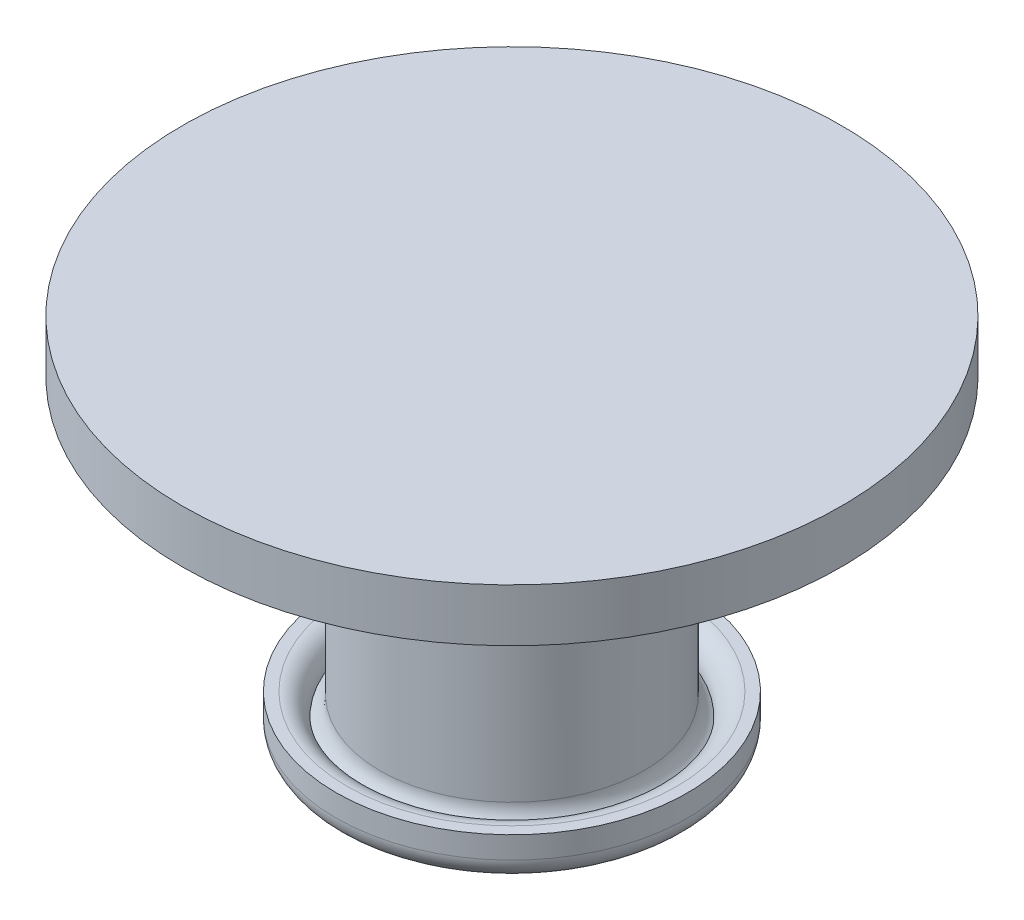
ISO-10303-21;
HEADER;
FILE_DESCRIPTION(('STEP AP214'),'2;1');
FILE_NAME('part.step','',(''),(''),'','','');
FILE_SCHEMA(('AUTOMOTIVE_DESIGN { 1 0 10303 214 1 1 1 1 }'));
ENDSEC;
DATA;
#1=APPLICATION_CONTEXT('core data for automotive mechanical design processes');
#2=APPLICATION_PROTOCOL_DEFINITION('international standard','automotive_design',2000,#1);
#3=PRODUCT_CONTEXT('',#1,'mechanical');
#4=PRODUCT('Part','Part','',(#3));
#5=PRODUCT_RELATED_PRODUCT_CATEGORY('part','',(#4));
#6=PRODUCT_DEFINITION_FORMATION('','',#4);
#7=PRODUCT_DEFINITION_CONTEXT('part definition',#1,'design');
#8=PRODUCT_DEFINITION('design','',#6,#7);
#9=PRODUCT_DEFINITION_SHAPE('','',#8);
#10=(LENGTH_UNIT() NAMED_UNIT(*) SI_UNIT(.MILLI.,.METRE.));
#11=(NAMED_UNIT(*) PLANE_ANGLE_UNIT() SI_UNIT($,.RADIAN.));
#12=(NAMED_UNIT(*) SI_UNIT($,.STERADIAN.) SOLID_ANGLE_UNIT());
#13=UNCERTAINTY_MEASURE_WITH_UNIT(LENGTH_MEASURE(1.E-05),#10,'distance_accuracy_value','');
#14=(GEOMETRIC_REPRESENTATION_CONTEXT(3) GLOBAL_UNCERTAINTY_ASSIGNED_CONTEXT((#13)) GLOBAL_UNIT_ASSIGNED_CONTEXT((#10,
#11,#12)) REPRESENTATION_CONTEXT('',''));
#15=CARTESIAN_POINT('',(0.,0.,0.));
#16=DIRECTION('',(0.,0.,1.));
#17=DIRECTION('',(1.,0.,0.));
#18=AXIS2_PLACEMENT_3D('',#15,#16,#17);
#19=CARTESIAN_POINT('',(0.,-7.2,0.));
#20=DIRECTION('',(0.,1.,0.));
#21=DIRECTION('',(0.,0.,1.));
#22=AXIS2_PLACEMENT_3D('',#19,#20,#21);
#23=CYLINDRICAL_SURFACE('',#22,3.);
#24=CARTESIAN_POINT('',(0.,-6.26698729810778,0.));
#25=DIRECTION('',(0.,-1.,0.));
#26=DIRECTION('',(0.,0.,-1.));
#27=AXIS2_PLACEMENT_3D('',#24,#25,#26);
#28=CIRCLE('',#27,3.);
#29=CARTESIAN_POINT('',(0.,-6.26698729810778,-3.));
#30=VERTEX_POINT('',#29);
#31=EDGE_CURVE('E129',#30,#30,#28,.F.);
#32=ORIENTED_EDGE('',*,*,#31,.T.);
#33=EDGE_LOOP('',(#32));
#34=FACE_BOUND('',#33,.T.);
#35=CARTESIAN_POINT('',(0.,0.,0.));
#36=DIRECTION('',(0.,1.,0.));
#37=DIRECTION('',(0.,0.,1.));
#38=AXIS2_PLACEMENT_3D('',#35,#36,#37);
#39=CIRCLE('',#38,3.);
#40=CARTESIAN_POINT('',(0.,0.,3.));
#41=VERTEX_POINT('',#40);
#42=EDGE_CURVE('E131',#41,#41,#39,.F.);
#43=ORIENTED_EDGE('',*,*,#42,.T.);
#44=EDGE_LOOP('',(#43));
#45=FACE_BOUND('',#44,.T.);
#46=ADVANCED_FACE('F30',(#34,#45),#23,.T.);
#47=CARTESIAN_POINT('',(0.,0.,0.));
#48=DIRECTION('',(0.,1.,0.));
#49=DIRECTION('',(0.,0.,1.));
#50=AXIS2_PLACEMENT_3D('',#47,#48,#49);
#51=PLANE('',#50);
#52=CARTESIAN_POINT('',(0.,0.,0.));
#53=DIRECTION('',(0.,1.,0.));
#54=DIRECTION('',(0.,0.,1.));
#55=AXIS2_PLACEMENT_3D('',#52,#53,#54);
#56=CIRCLE('',#55,7.5);
#57=CARTESIAN_POINT('',(0.,0.,7.5));
#58=VERTEX_POINT('',#57);
#59=EDGE_CURVE('E52',#58,#58,#56,.T.);
#60=ORIENTED_EDGE('',*,*,#59,.F.);
#61=EDGE_LOOP('',(#60));
#62=FACE_BOUND('',#61,.T.);
#63=ORIENTED_EDGE('',*,*,#42,.F.);
#64=EDGE_LOOP('',(#63));
#65=FACE_BOUND('',#64,.T.);
#66=ADVANCED_FACE('F72',(#62,#65),#51,.F.);
#67=CARTESIAN_POINT('',(0.,1.2,0.));
#68=DIRECTION('',(0.,-1.,0.));
#69=DIRECTION('',(0.,0.,-1.));
#70=AXIS2_PLACEMENT_3D('',#67,#68,#69);
#71=CYLINDRICAL_SURFACE('',#70,7.5);
#72=CARTESIAN_POINT('',(0.,1.2,0.));
#73=DIRECTION('',(0.,1.,0.));
#74=DIRECTION('',(0.,0.,1.));
#75=AXIS2_PLACEMENT_3D('',#72,#73,#74);
#76=CIRCLE('',#75,7.5);
#77=CARTESIAN_POINT('',(0.,1.2,7.5));
#78=VERTEX_POINT('',#77);
#79=EDGE_CURVE('E134',#78,#78,#76,.T.);
#80=ORIENTED_EDGE('',*,*,#79,.F.);
#81=EDGE_LOOP('',(#80));
#82=FACE_BOUND('',#81,.T.);
#83=ORIENTED_EDGE('',*,*,#59,.T.);
#84=EDGE_LOOP('',(#83));
#85=FACE_BOUND('',#84,.T.);
#86=ADVANCED_FACE('F78',(#82,#85),#71,.T.);
#87=CARTESIAN_POINT('',(0.,1.2,0.));
#88=DIRECTION('',(0.,1.,0.));
#89=DIRECTION('',(0.,0.,1.));
#90=AXIS2_PLACEMENT_3D('',#87,#88,#89);
#91=PLANE('',#90);
#92=ORIENTED_EDGE('',*,*,#79,.T.);
#93=EDGE_LOOP('',(#92));
#94=FACE_BOUND('',#93,.T.);
#95=ADVANCED_FACE('F87',(#94),#91,.T.);
#96=CARTESIAN_POINT('',(0.,-7.2,0.));
#97=DIRECTION('',(0.,-1.,0.));
#98=DIRECTION('',(0.,0.,-1.));
#99=AXIS2_PLACEMENT_3D('',#96,#97,#98);
#100=PLANE('',#99);
#101=CARTESIAN_POINT('',(0.,-7.2,0.));
#102=DIRECTION('',(0.,-1.,0.));
#103=DIRECTION('',(0.,0.,-1.));
#104=AXIS2_PLACEMENT_3D('',#101,#102,#103);
#105=CIRCLE('',#104,3.5);
#106=CARTESIAN_POINT('',(0.,-7.2,-3.5));
#107=VERTEX_POINT('',#106);
#108=EDGE_CURVE('E122',#107,#107,#105,.T.);
#109=ORIENTED_EDGE('',*,*,#108,.T.);
#110=EDGE_LOOP('',(#109));
#111=FACE_BOUND('',#110,.T.);
#112=CARTESIAN_POINT('',(0.,-7.2,0.));
#113=DIRECTION('',(0.,-1.,0.));
#114=DIRECTION('',(0.,0.,-1.));
#115=AXIS2_PLACEMENT_3D('',#112,#113,#114);
#116=CIRCLE('',#115,3.);
#117=CARTESIAN_POINT('',(0.,-7.2,-3.));
#118=VERTEX_POINT('',#117);
#119=EDGE_CURVE('E124',#118,#118,#116,.F.);
#120=ORIENTED_EDGE('',*,*,#119,.T.);
#121=EDGE_LOOP('',(#120));
#122=FACE_BOUND('',#121,.T.);
#123=ADVANCED_FACE('F85',(#111,#122),#100,.T.);
#124=CARTESIAN_POINT('',(0.,-6.2,0.));
#125=DIRECTION('',(0.,-1.,0.));
#126=DIRECTION('',(0.,0.,-1.));
#127=AXIS2_PLACEMENT_3D('',#124,#125,#126);
#128=CYLINDRICAL_SURFACE('',#127,4.);
#129=CARTESIAN_POINT('',(0.,-6.7,0.));
#130=DIRECTION('',(0.,-1.,0.));
#131=DIRECTION('',(0.,0.,-1.));
#132=AXIS2_PLACEMENT_3D('',#129,#130,#131);
#133=CIRCLE('',#132,4.);
#134=CARTESIAN_POINT('',(0.,-6.7,-4.));
#135=VERTEX_POINT('',#134);
#136=EDGE_CURVE('E43',#135,#135,#133,.F.);
#137=ORIENTED_EDGE('',*,*,#136,.T.);
#138=EDGE_LOOP('',(#137));
#139=FACE_BOUND('',#138,.T.);
#140=CARTESIAN_POINT('',(0.,-6.2,0.));
#141=DIRECTION('',(0.,-1.,0.));
#142=DIRECTION('',(0.,0.,-1.));
#143=AXIS2_PLACEMENT_3D('',#140,#141,#142);
#144=CIRCLE('',#143,4.);
#145=CARTESIAN_POINT('',(0.,-6.2,-4.));
#146=VERTEX_POINT('',#145);
#147=EDGE_CURVE('E48',#146,#146,#144,.T.);
#148=ORIENTED_EDGE('',*,*,#147,.T.);
#149=EDGE_LOOP('',(#148));
#150=FACE_BOUND('',#149,.T.);
#151=ADVANCED_FACE('F110',(#139,#150),#128,.T.);
#152=CARTESIAN_POINT('',(0.,-6.2,0.));
#153=DIRECTION('',(0.,-1.,0.));
#154=DIRECTION('',(0.,0.,-1.));
#155=AXIS2_PLACEMENT_3D('',#152,#153,#154);
#156=PLANE('',#155);
#157=CARTESIAN_POINT('',(0.,-6.2,0.));
#158=DIRECTION('',(0.,-1.,0.));
#159=DIRECTION('',(0.,0.,-1.));
#160=AXIS2_PLACEMENT_3D('',#157,#158,#159);
#161=CIRCLE('',#160,3.75);
#162=CARTESIAN_POINT('',(0.,-6.2,-3.75));
#163=VERTEX_POINT('',#162);
#164=EDGE_CURVE('E38',#163,#163,#161,.T.);
#165=ORIENTED_EDGE('',*,*,#164,.T.);
#166=EDGE_LOOP('',(#165));
#167=FACE_BOUND('',#166,.T.);
#168=ORIENTED_EDGE('',*,*,#147,.F.);
#169=EDGE_LOOP('',(#168));
#170=FACE_BOUND('',#169,.T.);
#171=ADVANCED_FACE('F103',(#167,#170),#156,.F.);
#172=CARTESIAN_POINT('',(0.,-6.2,0.));
#173=DIRECTION('',(0.,-1.,0.));
#174=DIRECTION('',(0.,0.,-1.));
#175=AXIS2_PLACEMENT_3D('',#172,#173,#174);
#176=PLANE('',#175);
#177=CARTESIAN_POINT('',(0.,-6.2,0.));
#178=DIRECTION('',(0.,-1.,0.));
#179=DIRECTION('',(0.,0.,-1.));
#180=AXIS2_PLACEMENT_3D('',#177,#178,#179);
#181=CIRCLE('',#180,2.);
#182=CARTESIAN_POINT('',(0.,-6.2,-2.));
#183=VERTEX_POINT('',#182);
#184=EDGE_CURVE('E10',#183,#183,#181,.T.);
#185=ORIENTED_EDGE('',*,*,#184,.T.);
#186=EDGE_LOOP('',(#185));
#187=FACE_BOUND('',#186,.T.);
#188=ADVANCED_FACE('F98',(#187),#176,.T.);
#189=CARTESIAN_POINT('',(0.,-6.7,0.));
#190=DIRECTION('',(0.,-1.,0.));
#191=DIRECTION('',(0.,0.,-1.));
#192=AXIS2_PLACEMENT_3D('',#189,#190,#191);
#193=TOROIDAL_SURFACE('',#192,3.75,0.5);
#194=ORIENTED_EDGE('',*,*,#164,.F.);
#195=EDGE_LOOP('',(#194));
#196=FACE_BOUND('',#195,.T.);
#197=CARTESIAN_POINT('',(0.,-6.7,0.));
#198=DIRECTION('',(0.,-1.,0.));
#199=DIRECTION('',(0.,0.,-1.));
#200=AXIS2_PLACEMENT_3D('',#197,#198,#199);
#201=CIRCLE('',#200,3.25);
#202=CARTESIAN_POINT('',(0.,-6.7,-3.25));
#203=VERTEX_POINT('',#202);
#204=EDGE_CURVE('E46',#203,#203,#201,.F.);
#205=ORIENTED_EDGE('',*,*,#204,.F.);
#206=EDGE_LOOP('',(#205));
#207=FACE_BOUND('',#206,.T.);
#208=ADVANCED_FACE('F96',(#196,#207),#193,.T.);
#209=CARTESIAN_POINT('',(0.,-6.26698729810778,0.));
#210=DIRECTION('',(0.,-1.,0.));
#211=DIRECTION('',(0.,0.,-1.));
#212=AXIS2_PLACEMENT_3D('',#209,#210,#211);
#213=TOROIDAL_SURFACE('',#212,3.5,0.5);
#214=ORIENTED_EDGE('',*,*,#204,.T.);
#215=EDGE_LOOP('',(#214));
#216=FACE_BOUND('',#215,.T.);
#217=ORIENTED_EDGE('',*,*,#31,.F.);
#218=EDGE_LOOP('',(#217));
#219=FACE_BOUND('',#218,.T.);
#220=ADVANCED_FACE('F67',(#216,#219),#213,.F.);
#221=CARTESIAN_POINT('',(0.,-6.7,0.));
#222=DIRECTION('',(0.,-1.,0.));
#223=DIRECTION('',(0.,0.,-1.));
#224=AXIS2_PLACEMENT_3D('',#221,#222,#223);
#225=TOROIDAL_SURFACE('',#224,3.5,0.5);
#226=ORIENTED_EDGE('',*,*,#136,.F.);
#227=EDGE_LOOP('',(#226));
#228=FACE_BOUND('',#227,.T.);
#229=ORIENTED_EDGE('',*,*,#108,.F.);
#230=EDGE_LOOP('',(#229));
#231=FACE_BOUND('',#230,.T.);
#232=ADVANCED_FACE('F61',(#228,#231),#225,.T.);
#233=CARTESIAN_POINT('',(0.,-6.7,0.));
#234=DIRECTION('',(0.,-1.,0.));
#235=DIRECTION('',(0.,0.,-1.));
#236=AXIS2_PLACEMENT_3D('',#233,#234,#235);
#237=TOROIDAL_SURFACE('',#236,3.,0.5);
#238=ORIENTED_EDGE('',*,*,#119,.F.);
#239=EDGE_LOOP('',(#238));
#240=FACE_BOUND('',#239,.T.);
#241=CARTESIAN_POINT('',(0.,-6.7,0.));
#242=DIRECTION('',(0.,-1.,0.));
#243=DIRECTION('',(0.,0.,-1.));
#244=AXIS2_PLACEMENT_3D('',#241,#242,#243);
#245=CIRCLE('',#244,2.5);
#246=CARTESIAN_POINT('',(0.,-6.7,-2.5));
#247=VERTEX_POINT('',#246);
#248=EDGE_CURVE('E34',#247,#247,#245,.T.);
#249=ORIENTED_EDGE('',*,*,#248,.F.);
#250=EDGE_LOOP('',(#249));
#251=FACE_BOUND('',#250,.T.);
#252=ADVANCED_FACE('F32',(#240,#251),#237,.T.);
#253=CARTESIAN_POINT('',(0.,-6.7,0.));
#254=DIRECTION('',(0.,-1.,0.));
#255=DIRECTION('',(0.,0.,-1.));
#256=AXIS2_PLACEMENT_3D('',#253,#254,#255);
#257=TOROIDAL_SURFACE('',#256,2.,0.5);
#258=ORIENTED_EDGE('',*,*,#248,.T.);
#259=EDGE_LOOP('',(#258));
#260=FACE_BOUND('',#259,.T.);
#261=ORIENTED_EDGE('',*,*,#184,.F.);
#262=EDGE_LOOP('',(#261));
#263=FACE_BOUND('',#262,.T.);
#264=ADVANCED_FACE('F57',(#260,#263),#257,.F.);
#265=CLOSED_SHELL('',(#46,#66,#86,#95,#123,#151,#171,#188,#208,#220,#232,#252,#264));
#266=MANIFOLD_SOLID_BREP('B2',#265);
#267=ADVANCED_BREP_SHAPE_REPRESENTATION('',(#18,#266),#14);
#268=SHAPE_DEFINITION_REPRESENTATION(#9,#267);
ENDSEC;
END-ISO-10303-21;
